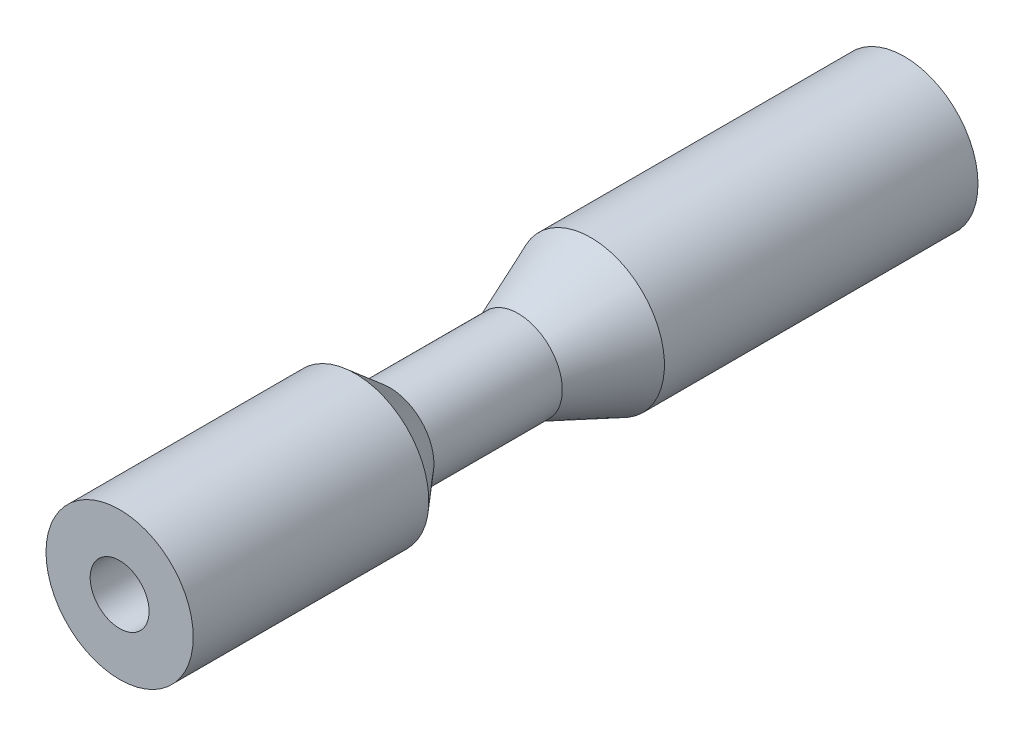
ISO-10303-21;
HEADER;
FILE_DESCRIPTION(('STEP AP214'),'2;1');
FILE_NAME('part.step','',(''),(''),'','','');
FILE_SCHEMA(('AUTOMOTIVE_DESIGN { 1 0 10303 214 1 1 1 1 }'));
ENDSEC;
DATA;
#1=APPLICATION_CONTEXT('core data for automotive mechanical design processes');
#2=APPLICATION_PROTOCOL_DEFINITION('international standard','automotive_design',2000,#1);
#3=PRODUCT_CONTEXT('',#1,'mechanical');
#4=PRODUCT('Part','Part','',(#3));
#5=PRODUCT_RELATED_PRODUCT_CATEGORY('part','',(#4));
#6=PRODUCT_DEFINITION_FORMATION('','',#4);
#7=PRODUCT_DEFINITION_CONTEXT('part definition',#1,'design');
#8=PRODUCT_DEFINITION('design','',#6,#7);
#9=PRODUCT_DEFINITION_SHAPE('','',#8);
#10=(LENGTH_UNIT() NAMED_UNIT(*) SI_UNIT(.MILLI.,.METRE.));
#11=(NAMED_UNIT(*) PLANE_ANGLE_UNIT() SI_UNIT($,.RADIAN.));
#12=(NAMED_UNIT(*) SI_UNIT($,.STERADIAN.) SOLID_ANGLE_UNIT());
#13=UNCERTAINTY_MEASURE_WITH_UNIT(LENGTH_MEASURE(1.E-05),#10,'distance_accuracy_value','');
#14=(GEOMETRIC_REPRESENTATION_CONTEXT(3) GLOBAL_UNCERTAINTY_ASSIGNED_CONTEXT((#13)) GLOBAL_UNIT_ASSIGNED_CONTEXT((#10,
#11,#12)) REPRESENTATION_CONTEXT('',''));
#15=CARTESIAN_POINT('',(0.,0.,0.));
#16=DIRECTION('',(0.,0.,1.));
#17=DIRECTION('',(1.,0.,0.));
#18=AXIS2_PLACEMENT_3D('',#15,#16,#17);
#19=CARTESIAN_POINT('',(0.,0.,27.));
#20=DIRECTION('',(0.,0.,-1.));
#21=DIRECTION('',(-1.,0.,0.));
#22=AXIS2_PLACEMENT_3D('',#19,#20,#21);
#23=CYLINDRICAL_SURFACE('',#22,2.5);
#24=CARTESIAN_POINT('',(0.,0.,27.));
#25=DIRECTION('',(0.,0.,1.));
#26=DIRECTION('',(1.,0.,0.));
#27=AXIS2_PLACEMENT_3D('',#24,#25,#26);
#28=CIRCLE('',#27,2.5);
#29=CARTESIAN_POINT('',(2.5,0.,27.));
#30=VERTEX_POINT('',#29);
#31=EDGE_CURVE('E41',#30,#30,#28,.T.);
#32=ORIENTED_EDGE('',*,*,#31,.F.);
#33=EDGE_LOOP('',(#32));
#34=FACE_BOUND('',#33,.T.);
#35=CARTESIAN_POINT('',(0.,0.,19.));
#36=DIRECTION('',(0.,0.,-1.));
#37=DIRECTION('',(-1.,0.,0.));
#38=AXIS2_PLACEMENT_3D('',#35,#36,#37);
#39=CIRCLE('',#38,2.5);
#40=CARTESIAN_POINT('',(-2.5,0.,19.));
#41=VERTEX_POINT('',#40);
#42=EDGE_CURVE('E45',#41,#41,#39,.T.);
#43=ORIENTED_EDGE('',*,*,#42,.F.);
#44=EDGE_LOOP('',(#43));
#45=FACE_BOUND('',#44,.T.);
#46=ADVANCED_FACE('F30',(#34,#45),#23,.T.);
#47=CARTESIAN_POINT('',(0.,0.,27.));
#48=DIRECTION('',(0.,0.,1.));
#49=DIRECTION('',(1.,0.,0.));
#50=AXIS2_PLACEMENT_3D('',#47,#48,#49);
#51=PLANE('',#50);
#52=CARTESIAN_POINT('',(0.,0.,27.));
#53=DIRECTION('',(0.,0.,1.));
#54=DIRECTION('',(1.,0.,0.));
#55=AXIS2_PLACEMENT_3D('',#52,#53,#54);
#56=CIRCLE('',#55,0.999999999999998);
#57=CARTESIAN_POINT('',(0.999999999999998,0.,27.));
#58=VERTEX_POINT('',#57);
#59=EDGE_CURVE('E62',#58,#58,#56,.T.);
#60=ORIENTED_EDGE('',*,*,#59,.F.);
#61=EDGE_LOOP('',(#60));
#62=FACE_BOUND('',#61,.T.);
#63=ORIENTED_EDGE('',*,*,#31,.T.);
#64=EDGE_LOOP('',(#63));
#65=FACE_BOUND('',#64,.T.);
#66=ADVANCED_FACE('F89',(#62,#65),#51,.T.);
#67=CARTESIAN_POINT('',(0.,0.,17.8276762664459));
#68=DIRECTION('',(0.,0.,1.));
#69=DIRECTION('',(1.,0.,0.));
#70=AXIS2_PLACEMENT_3D('',#67,#68,#69);
#71=CONICAL_SURFACE('',#70,1.5,0.706237021045399);
#72=ORIENTED_EDGE('',*,*,#42,.T.);
#73=EDGE_LOOP('',(#72));
#74=FACE_BOUND('',#73,.T.);
#75=CARTESIAN_POINT('',(0.,0.,17.8276762664459));
#76=DIRECTION('',(0.,0.,-1.));
#77=DIRECTION('',(-1.,0.,0.));
#78=AXIS2_PLACEMENT_3D('',#75,#76,#77);
#79=CIRCLE('',#78,1.5);
#80=CARTESIAN_POINT('',(-1.5,0.,17.8276762664459));
#81=VERTEX_POINT('',#80);
#82=EDGE_CURVE('E50',#81,#81,#79,.T.);
#83=ORIENTED_EDGE('',*,*,#82,.F.);
#84=EDGE_LOOP('',(#83));
#85=FACE_BOUND('',#84,.T.);
#86=ADVANCED_FACE('F94',(#74,#85),#71,.T.);
#87=CARTESIAN_POINT('',(0.,0.,0.));
#88=DIRECTION('',(0.,0.,-1.));
#89=DIRECTION('',(-1.,0.,0.));
#90=AXIS2_PLACEMENT_3D('',#87,#88,#89);
#91=CYLINDRICAL_SURFACE('',#90,1.5);
#92=ORIENTED_EDGE('',*,*,#82,.T.);
#93=EDGE_LOOP('',(#92));
#94=FACE_BOUND('',#93,.T.);
#95=CARTESIAN_POINT('',(0.,0.,13.4678422706706));
#96=DIRECTION('',(0.,0.,-1.));
#97=DIRECTION('',(-1.,0.,0.));
#98=AXIS2_PLACEMENT_3D('',#95,#96,#97);
#99=CIRCLE('',#98,1.5);
#100=CARTESIAN_POINT('',(-1.5,0.,13.4678422706706));
#101=VERTEX_POINT('',#100);
#102=EDGE_CURVE('E53',#101,#101,#99,.T.);
#103=ORIENTED_EDGE('',*,*,#102,.F.);
#104=EDGE_LOOP('',(#103));
#105=FACE_BOUND('',#104,.T.);
#106=ADVANCED_FACE('F84',(#94,#105),#91,.T.);
#107=CARTESIAN_POINT('',(0.,0.,11.));
#108=DIRECTION('',(0.,0.,-1.));
#109=DIRECTION('',(-1.,0.,0.));
#110=AXIS2_PLACEMENT_3D('',#107,#108,#109);
#111=CONICAL_SURFACE('',#110,2.5,0.384991632666817);
#112=ORIENTED_EDGE('',*,*,#102,.T.);
#113=EDGE_LOOP('',(#112));
#114=FACE_BOUND('',#113,.T.);
#115=CARTESIAN_POINT('',(0.,0.,11.));
#116=DIRECTION('',(0.,0.,-1.));
#117=DIRECTION('',(-1.,0.,0.));
#118=AXIS2_PLACEMENT_3D('',#115,#116,#117);
#119=CIRCLE('',#118,2.5);
#120=CARTESIAN_POINT('',(-2.5,0.,11.));
#121=VERTEX_POINT('',#120);
#122=EDGE_CURVE('E56',#121,#121,#119,.T.);
#123=ORIENTED_EDGE('',*,*,#122,.F.);
#124=EDGE_LOOP('',(#123));
#125=FACE_BOUND('',#124,.T.);
#126=ADVANCED_FACE('F78',(#114,#125),#111,.T.);
#127=CARTESIAN_POINT('',(0.,0.,0.));
#128=DIRECTION('',(0.,0.,1.));
#129=DIRECTION('',(1.,0.,0.));
#130=AXIS2_PLACEMENT_3D('',#127,#128,#129);
#131=PLANE('',#130);
#132=CARTESIAN_POINT('',(0.,0.,0.));
#133=DIRECTION('',(0.,0.,-1.));
#134=DIRECTION('',(-1.,0.,0.));
#135=AXIS2_PLACEMENT_3D('',#132,#133,#134);
#136=CIRCLE('',#135,0.25);
#137=CARTESIAN_POINT('',(-0.25,0.,0.));
#138=VERTEX_POINT('',#137);
#139=EDGE_CURVE('E68',#138,#138,#136,.T.);
#140=ORIENTED_EDGE('',*,*,#139,.F.);
#141=EDGE_LOOP('',(#140));
#142=FACE_BOUND('',#141,.T.);
#143=CARTESIAN_POINT('',(0.,0.,0.));
#144=DIRECTION('',(0.,0.,1.));
#145=DIRECTION('',(1.,0.,0.));
#146=AXIS2_PLACEMENT_3D('',#143,#144,#145);
#147=CIRCLE('',#146,0.499999999999963);
#148=CARTESIAN_POINT('',(0.499999999999962,0.,0.));
#149=VERTEX_POINT('',#148);
#150=EDGE_CURVE('E10',#149,#149,#147,.F.);
#151=ORIENTED_EDGE('',*,*,#150,.T.);
#152=EDGE_LOOP('',(#151));
#153=FACE_BOUND('',#152,.T.);
#154=ADVANCED_FACE('F75',(#142,#153),#131,.F.);
#155=CARTESIAN_POINT('',(0.,0.,0.35265396141693));
#156=DIRECTION('',(0.,0.,1.));
#157=DIRECTION('',(1.,0.,0.));
#158=AXIS2_PLACEMENT_3D('',#155,#156,#157);
#159=CIRCLE('',#158,2.5);
#160=CARTESIAN_POINT('',(2.5,0.,0.35265396141693));
#161=VERTEX_POINT('',#160);
#162=EDGE_CURVE('E37',#161,#161,#159,.T.);
#163=ORIENTED_EDGE('',*,*,#162,.T.);
#164=EDGE_LOOP('',(#163));
#165=FACE_BOUND('',#164,.T.);
#166=ORIENTED_EDGE('',*,*,#122,.T.);
#167=EDGE_LOOP('',(#166));
#168=FACE_BOUND('',#167,.T.);
#169=ADVANCED_FACE('F77',(#165,#168),#23,.T.);
#170=CARTESIAN_POINT('',(0.,0.,0.35265396141693));
#171=DIRECTION('',(0.,0.,1.));
#172=DIRECTION('',(1.,0.,0.));
#173=AXIS2_PLACEMENT_3D('',#170,#171,#172);
#174=CONICAL_SURFACE('',#173,2.5,1.39626340159547);
#175=CARTESIAN_POINT('',(0.499999999999962,0.,0.));
#176=CARTESIAN_POINT('',(0.520833333333296,0.,0.00367347876475963));
#177=CARTESIAN_POINT('',(0.541666666666629,0.,0.00734695752951932));
#178=CARTESIAN_POINT('',(0.583333333333297,0.,0.0146939150590387));
#179=CARTESIAN_POINT('',(0.60416666666663,0.,0.0183673938237984));
#180=CARTESIAN_POINT('',(0.645833333333298,0.,0.0257143513533178));
#181=CARTESIAN_POINT('',(0.666666666666632,0.,0.0293878301180775));
#182=CARTESIAN_POINT('',(0.708333333333299,0.,0.0367347876475968));
#183=CARTESIAN_POINT('',(0.729166666666633,0.,0.0404082664123565));
#184=CARTESIAN_POINT('',(0.7708333333333,0.,0.0477552239418759));
#185=CARTESIAN_POINT('',(0.791666666666634,0.,0.0514287027066356));
#186=CARTESIAN_POINT('',(0.833333333333301,0.,0.058775660236155));
#187=CARTESIAN_POINT('',(0.854166666666635,0.,0.0624491390009146));
#188=CARTESIAN_POINT('',(0.895833333333303,0.,0.069796096530434));
#189=CARTESIAN_POINT('',(0.916666666666636,0.,0.0734695752951937));
#190=CARTESIAN_POINT('',(0.958333333333304,0.,0.0808165328247131));
#191=CARTESIAN_POINT('',(0.979166666666638,0.,0.0844900115894728));
#192=CARTESIAN_POINT('',(1.0208333333333,0.,0.0918369691189922));
#193=CARTESIAN_POINT('',(1.04166666666664,0.,0.0955104478837518));
#194=CARTESIAN_POINT('',(1.08333333333331,0.,0.102857405413271));
#195=CARTESIAN_POINT('',(1.10416666666664,0.,0.106530884178031));
#196=CARTESIAN_POINT('',(1.14583333333331,0.,0.11387784170755));
#197=CARTESIAN_POINT('',(1.16666666666664,0.,0.11755132047231));
#198=CARTESIAN_POINT('',(1.20833333333331,0.,0.124898278001829));
#199=CARTESIAN_POINT('',(1.22916666666664,0.,0.128571756766589));
#200=CARTESIAN_POINT('',(1.27083333333331,0.,0.135918714296108));
#201=CARTESIAN_POINT('',(1.29166666666664,0.,0.139592193060868));
#202=CARTESIAN_POINT('',(1.33333333333331,0.,0.146939150590387));
#203=CARTESIAN_POINT('',(1.35416666666664,0.,0.150612629355147));
#204=CARTESIAN_POINT('',(1.39583333333331,0.,0.157959586884667));
#205=CARTESIAN_POINT('',(1.41666666666665,0.,0.161633065649426));
#206=CARTESIAN_POINT('',(1.45833333333331,0.,0.168980023178946));
#207=CARTESIAN_POINT('',(1.47916666666665,0.,0.172653501943705));
#208=CARTESIAN_POINT('',(1.52083333333331,0.,0.180000459473225));
#209=CARTESIAN_POINT('',(1.54166666666665,0.,0.183673938237984));
#210=CARTESIAN_POINT('',(1.58333333333332,0.,0.191020895767504));
#211=CARTESIAN_POINT('',(1.60416666666665,0.,0.194694374532263));
#212=CARTESIAN_POINT('',(1.64583333333332,0.,0.202041332061783));
#213=CARTESIAN_POINT('',(1.66666666666665,0.,0.205714810826542));
#214=CARTESIAN_POINT('',(1.70833333333332,0.,0.213061768356062));
#215=CARTESIAN_POINT('',(1.72916666666665,0.,0.216735247120822));
#216=CARTESIAN_POINT('',(1.77083333333332,0.,0.224082204650341));
#217=CARTESIAN_POINT('',(1.79166666666665,0.,0.227755683415101));
#218=CARTESIAN_POINT('',(1.83333333333332,0.,0.23510264094462));
#219=CARTESIAN_POINT('',(1.85416666666665,0.,0.23877611970938));
#220=CARTESIAN_POINT('',(1.89583333333332,0.,0.246123077238899));
#221=CARTESIAN_POINT('',(1.91666666666666,0.,0.249796556003659));
#222=CARTESIAN_POINT('',(1.95833333333332,0.,0.257143513533178));
#223=CARTESIAN_POINT('',(1.97916666666666,0.,0.260816992297938));
#224=CARTESIAN_POINT('',(2.02083333333332,0.,0.268163949827457));
#225=CARTESIAN_POINT('',(2.04166666666666,0.,0.271837428592217));
#226=CARTESIAN_POINT('',(2.08333333333333,0.,0.279184386121736));
#227=CARTESIAN_POINT('',(2.10416666666666,0.,0.282857864886496));
#228=CARTESIAN_POINT('',(2.14583333333333,0.,0.290204822416015));
#229=CARTESIAN_POINT('',(2.16666666666666,0.,0.293878301180775));
#230=CARTESIAN_POINT('',(2.20833333333333,0.,0.301225258710294));
#231=CARTESIAN_POINT('',(2.22916666666666,0.,0.304898737475054));
#232=CARTESIAN_POINT('',(2.27083333333333,0.,0.312245695004573));
#233=CARTESIAN_POINT('',(2.29166666666666,0.,0.315919173769333));
#234=CARTESIAN_POINT('',(2.33333333333333,0.,0.323266131298853));
#235=CARTESIAN_POINT('',(2.35416666666666,0.,0.326939610063612));
#236=CARTESIAN_POINT('',(2.39583333333333,0.,0.334286567593132));
#237=CARTESIAN_POINT('',(2.41666666666667,0.,0.337960046357891));
#238=CARTESIAN_POINT('',(2.45833333333333,0.,0.345307003887411));
#239=CARTESIAN_POINT('',(2.47916666666667,0.,0.34898048265217));
#240=CARTESIAN_POINT('',(2.5,0.,0.35265396141693));
#241=B_SPLINE_CURVE_WITH_KNOTS('',3,(#175,#176,#177,#178,#179,#180,#181,#182,#183,#184,#185,
#186,#187,#188,#189,#190,#191,#192,#193,#194,#195,#196,#197,#198,#199,#200,#201,#202,#203,#204,
#205,#206,#207,#208,#209,#210,#211,#212,#213,#214,#215,#216,#217,#218,#219,#220,#221,#222,#223,
#224,#225,#226,#227,#228,#229,#230,#231,#232,#233,#234,#235,#236,#237,#238,#239,#240),
.UNSPECIFIED.,.F.,.F.,(4,2,2,2,2,2,2,2,2,2,2,2,2,2,2,2,2,2,2,2,2,2,2,2,2,2,2,2,2,2,2,2,4),(0.,
0.0634641632428602,0.12692832648572,0.190392489728581,0.253856652971441,0.317320816214301,
0.380784979457161,0.444249142700022,0.507713305942882,0.571177469185742,0.634641632428602,
0.698105795671462,0.761569958914323,0.825034122157183,0.888498285400043,0.951962448642903,
1.01542661188576,1.07889077512862,1.14235493837148,1.20581910161434,1.2692832648572,
1.33274742810006,1.39621159134293,1.45967575458579,1.52313991782865,1.58660408107151,
1.65006824431437,1.71353240755723,1.77699657080009,1.84046073404295,1.90392489728581,
1.96738906052867,2.03085322377153),.UNSPECIFIED.);
#242=EDGE_CURVE('BSEAM32',#149,#161,#241,.T.);
#243=ORIENTED_EDGE('',*,*,#150,.F.);
#244=ORIENTED_EDGE('',*,*,#162,.F.);
#245=ORIENTED_EDGE('',*,*,#242,.T.);
#246=ORIENTED_EDGE('',*,*,#242,.F.);
#247=EDGE_LOOP('',(#243,#245,#244,#246));
#248=FACE_BOUND('',#247,.T.);
#249=ADVANCED_FACE('F32',(#248),#174,.T.);
#250=CARTESIAN_POINT('',(0.,0.,1.));
#251=DIRECTION('',(0.,0.,1.));
#252=DIRECTION('',(1.,0.,0.));
#253=AXIS2_PLACEMENT_3D('',#250,#251,#252);
#254=CONICAL_SURFACE('',#253,0.999999999999994,1.02974425867665);
#255=CARTESIAN_POINT('',(0.,0.,0.549354535729329));
#256=DIRECTION('',(0.,0.,1.));
#257=DIRECTION('',(1.,0.,0.));
#258=AXIS2_PLACEMENT_3D('',#255,#256,#257);
#259=CIRCLE('',#258,0.25);
#260=CARTESIAN_POINT('',(0.25,0.,0.549354535729329));
#261=VERTEX_POINT('',#260);
#262=EDGE_CURVE('E65',#261,#261,#259,.T.);
#263=CARTESIAN_POINT('',(0.,0.,1.));
#264=DIRECTION('',(0.,0.,1.));
#265=DIRECTION('',(1.,0.,0.));
#266=AXIS2_PLACEMENT_3D('',#263,#264,#265);
#267=CIRCLE('',#266,0.999999999999994);
#268=CARTESIAN_POINT('',(0.999999999999994,0.,1.));
#269=VERTEX_POINT('',#268);
#270=EDGE_CURVE('E59',#269,#269,#267,.T.);
#271=CARTESIAN_POINT('',(0.25,0.,0.549354535729329));
#272=CARTESIAN_POINT('',(0.2578125,0.,0.554048759315481));
#273=CARTESIAN_POINT('',(0.265625,0.,0.558742982901634));
#274=CARTESIAN_POINT('',(0.281249999999999,0.,0.56813143007394));
#275=CARTESIAN_POINT('',(0.289062499999999,0.,0.572825653660093));
#276=CARTESIAN_POINT('',(0.304687499999999,0.,0.582214100832398));
#277=CARTESIAN_POINT('',(0.312499999999999,0.,0.586908324418551));
#278=CARTESIAN_POINT('',(0.328124999999999,0.,0.596296771590857));
#279=CARTESIAN_POINT('',(0.335937499999999,0.,0.60099099517701));
#280=CARTESIAN_POINT('',(0.351562499999999,0.,0.610379442349316));
#281=CARTESIAN_POINT('',(0.359374999999999,0.,0.615073665935468));
#282=CARTESIAN_POINT('',(0.374999999999999,0.,0.624462113107774));
#283=CARTESIAN_POINT('',(0.382812499999999,0.,0.629156336693927));
#284=CARTESIAN_POINT('',(0.398437499999999,0.,0.638544783866232));
#285=CARTESIAN_POINT('',(0.406249999999998,0.,0.643239007452385));
#286=CARTESIAN_POINT('',(0.421874999999998,0.,0.652627454624691));
#287=CARTESIAN_POINT('',(0.429687499999998,0.,0.657321678210844));
#288=CARTESIAN_POINT('',(0.445312499999998,0.,0.666710125383149));
#289=CARTESIAN_POINT('',(0.453124999999998,0.,0.671404348969302));
#290=CARTESIAN_POINT('',(0.468749999999998,0.,0.680792796141608));
#291=CARTESIAN_POINT('',(0.476562499999998,0.,0.685487019727761));
#292=CARTESIAN_POINT('',(0.492187499999998,0.,0.694875466900067));
#293=CARTESIAN_POINT('',(0.499999999999998,0.,0.699569690486219));
#294=CARTESIAN_POINT('',(0.515624999999998,0.,0.708958137658525));
#295=CARTESIAN_POINT('',(0.523437499999998,0.,0.713652361244678));
#296=CARTESIAN_POINT('',(0.539062499999997,0.,0.723040808416983));
#297=CARTESIAN_POINT('',(0.546874999999997,0.,0.727735032003136));
#298=CARTESIAN_POINT('',(0.562499999999997,0.,0.737123479175442));
#299=CARTESIAN_POINT('',(0.570312499999997,0.,0.741817702761595));
#300=CARTESIAN_POINT('',(0.585937499999997,0.,0.751206149933901));
#301=CARTESIAN_POINT('',(0.593749999999997,0.,0.755900373520053));
#302=CARTESIAN_POINT('',(0.609374999999997,0.,0.765288820692359));
#303=CARTESIAN_POINT('',(0.617187499999997,0.,0.769983044278512));
#304=CARTESIAN_POINT('',(0.632812499999997,0.,0.779371491450818));
#305=CARTESIAN_POINT('',(0.640624999999997,0.,0.78406571503697));
#306=CARTESIAN_POINT('',(0.656249999999996,0.,0.793454162209276));
#307=CARTESIAN_POINT('',(0.664062499999996,0.,0.798148385795429));
#308=CARTESIAN_POINT('',(0.679687499999996,0.,0.807536832967734));
#309=CARTESIAN_POINT('',(0.687499999999996,0.,0.812231056553887));
#310=CARTESIAN_POINT('',(0.703124999999996,0.,0.821619503726193));
#311=CARTESIAN_POINT('',(0.710937499999996,0.,0.826313727312346));
#312=CARTESIAN_POINT('',(0.726562499999996,0.,0.835702174484652));
#313=CARTESIAN_POINT('',(0.734374999999996,0.,0.840396398070804));
#314=CARTESIAN_POINT('',(0.749999999999996,0.,0.84978484524311));
#315=CARTESIAN_POINT('',(0.757812499999996,0.,0.854479068829263));
#316=CARTESIAN_POINT('',(0.773437499999995,0.,0.863867516001569));
#317=CARTESIAN_POINT('',(0.781249999999995,0.,0.868561739587721));
#318=CARTESIAN_POINT('',(0.796874999999995,0.,0.877950186760027));
#319=CARTESIAN_POINT('',(0.804687499999995,0.,0.88264441034618));
#320=CARTESIAN_POINT('',(0.820312499999995,0.,0.892032857518485));
#321=CARTESIAN_POINT('',(0.828124999999995,0.,0.896727081104638));
#322=CARTESIAN_POINT('',(0.843749999999995,0.,0.906115528276944));
#323=CARTESIAN_POINT('',(0.851562499999995,0.,0.910809751863097));
#324=CARTESIAN_POINT('',(0.867187499999995,0.,0.920198199035403));
#325=CARTESIAN_POINT('',(0.874999999999995,0.,0.924892422621555));
#326=CARTESIAN_POINT('',(0.890624999999994,0.,0.934280869793861));
#327=CARTESIAN_POINT('',(0.898437499999994,0.,0.938975093380014));
#328=CARTESIAN_POINT('',(0.914062499999994,0.,0.94836354055232));
#329=CARTESIAN_POINT('',(0.921874999999994,0.,0.953057764138472));
#330=CARTESIAN_POINT('',(0.937499999999994,0.,0.962446211310778));
#331=CARTESIAN_POINT('',(0.945312499999994,0.,0.967140434896931));
#332=CARTESIAN_POINT('',(0.960937499999994,0.,0.976528882069237));
#333=CARTESIAN_POINT('',(0.968749999999994,0.,0.981223105655389));
#334=CARTESIAN_POINT('',(0.984374999999994,0.,0.990611552827695));
#335=CARTESIAN_POINT('',(0.992187499999994,0.,0.995305776413848));
#336=CARTESIAN_POINT('',(0.999999999999994,0.,1.));
#337=B_SPLINE_CURVE_WITH_KNOTS('',3,(#271,#272,#273,#274,#275,#276,#277,#278,#279,#280,#281,
#282,#283,#284,#285,#286,#287,#288,#289,#290,#291,#292,#293,#294,#295,#296,#297,#298,#299,#300,
#301,#302,#303,#304,#305,#306,#307,#308,#309,#310,#311,#312,#313,#314,#315,#316,#317,#318,#319,
#320,#321,#322,#323,#324,#325,#326,#327,#328,#329,#330,#331,#332,#333,#334,#335,#336),
.UNSPECIFIED.,.F.,.F.,(4,2,2,2,2,2,2,2,2,2,2,2,2,2,2,2,2,2,2,2,2,2,2,2,2,2,2,2,2,2,2,2,4),(0.,
0.0273429702472341,0.0546859404944682,0.0820289107417025,0.109371880988937,0.136714851236171,
0.164057821483405,0.191400791730639,0.218743761977873,0.246086732225107,0.273429702472342,
0.300772672719576,0.32811564296681,0.355458613214044,0.382801583461278,0.410144553708513,
0.437487523955747,0.464830494202981,0.492173464450215,0.519516434697449,0.546859404944683,
0.574202375191918,0.601545345439152,0.628888315686386,0.65623128593362,0.683574256180854,
0.710917226428088,0.738260196675322,0.765603166922557,0.792946137169791,0.820289107417025,
0.847632077664259,0.874975047911493),.UNSPECIFIED.);
#338=EDGE_CURVE('BSEAM115',#261,#269,#337,.T.);
#339=ORIENTED_EDGE('',*,*,#262,.F.);
#340=ORIENTED_EDGE('',*,*,#270,.T.);
#341=ORIENTED_EDGE('',*,*,#338,.T.);
#342=ORIENTED_EDGE('',*,*,#338,.F.);
#343=EDGE_LOOP('',(#339,#341,#340,#342));
#344=FACE_BOUND('',#343,.T.);
#345=ADVANCED_FACE('F115',(#344),#254,.F.);
#346=CARTESIAN_POINT('',(0.,0.,27.));
#347=DIRECTION('',(0.,0.,1.));
#348=DIRECTION('',(1.,0.,0.));
#349=AXIS2_PLACEMENT_3D('',#346,#347,#348);
#350=CYLINDRICAL_SURFACE('',#349,0.999999999999996);
#351=ORIENTED_EDGE('',*,*,#270,.F.);
#352=EDGE_LOOP('',(#351));
#353=FACE_BOUND('',#352,.T.);
#354=ORIENTED_EDGE('',*,*,#59,.T.);
#355=EDGE_LOOP('',(#354));
#356=FACE_BOUND('',#355,.T.);
#357=ADVANCED_FACE('F118',(#353,#356),#350,.F.);
#358=CARTESIAN_POINT('',(0.,0.,27.001));
#359=DIRECTION('',(0.,0.,-1.));
#360=DIRECTION('',(-1.,0.,0.));
#361=AXIS2_PLACEMENT_3D('',#358,#359,#360);
#362=CYLINDRICAL_SURFACE('',#361,0.25);
#363=ORIENTED_EDGE('',*,*,#139,.T.);
#364=EDGE_LOOP('',(#363));
#365=FACE_BOUND('',#364,.T.);
#366=ORIENTED_EDGE('',*,*,#262,.T.);
#367=EDGE_LOOP('',(#366));
#368=FACE_BOUND('',#367,.T.);
#369=ADVANCED_FACE('F72',(#365,#368),#362,.F.);
#370=CLOSED_SHELL('',(#46,#66,#86,#106,#126,#154,#169,#249,#345,#357,#369));
#371=MANIFOLD_SOLID_BREP('B2',#370);
#372=ADVANCED_BREP_SHAPE_REPRESENTATION('',(#18,#371),#14);
#373=SHAPE_DEFINITION_REPRESENTATION(#9,#372);
ENDSEC;
END-ISO-10303-21;
